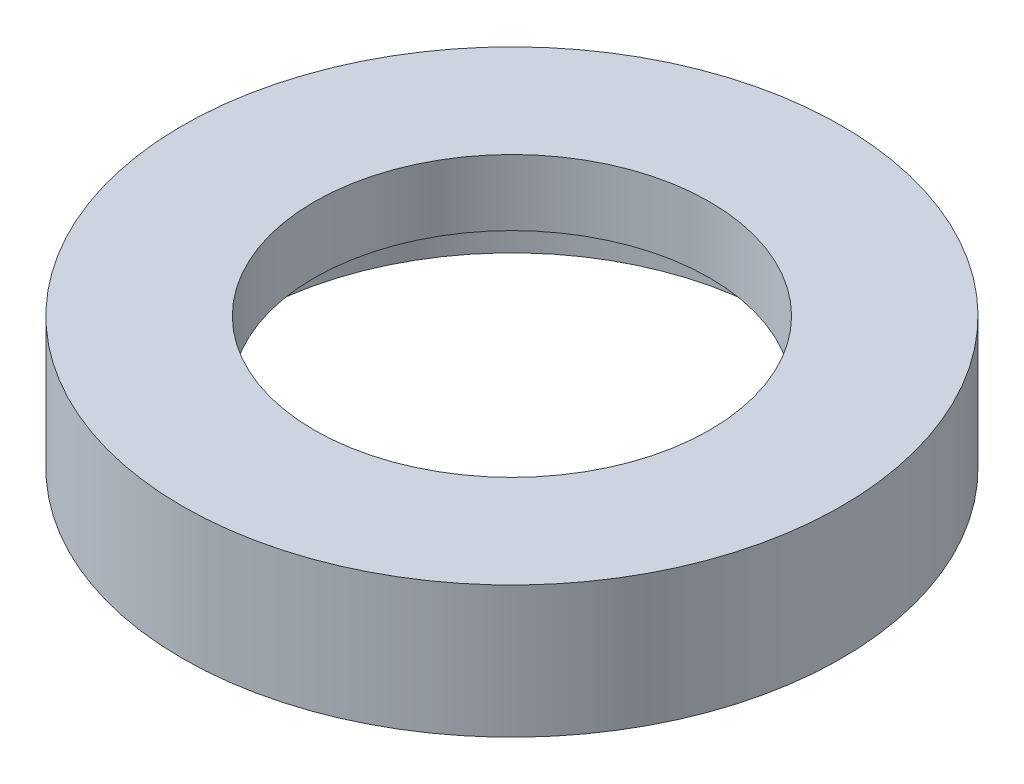
ISO-10303-21;
HEADER;
FILE_DESCRIPTION(('STEP AP214'),'2;1');
FILE_NAME('part.step','',(''),(''),'','','');
FILE_SCHEMA(('AUTOMOTIVE_DESIGN { 1 0 10303 214 1 1 1 1 }'));
ENDSEC;
DATA;
#1=APPLICATION_CONTEXT('core data for automotive mechanical design processes');
#2=APPLICATION_PROTOCOL_DEFINITION('international standard','automotive_design',2000,#1);
#3=PRODUCT_CONTEXT('',#1,'mechanical');
#4=PRODUCT('Part','Part','',(#3));
#5=PRODUCT_RELATED_PRODUCT_CATEGORY('part','',(#4));
#6=PRODUCT_DEFINITION_FORMATION('','',#4);
#7=PRODUCT_DEFINITION_CONTEXT('part definition',#1,'design');
#8=PRODUCT_DEFINITION('design','',#6,#7);
#9=PRODUCT_DEFINITION_SHAPE('','',#8);
#10=(LENGTH_UNIT() NAMED_UNIT(*) SI_UNIT(.MILLI.,.METRE.));
#11=(NAMED_UNIT(*) PLANE_ANGLE_UNIT() SI_UNIT($,.RADIAN.));
#12=(NAMED_UNIT(*) SI_UNIT($,.STERADIAN.) SOLID_ANGLE_UNIT());
#13=UNCERTAINTY_MEASURE_WITH_UNIT(LENGTH_MEASURE(1.E-05),#10,'distance_accuracy_value','');
#14=(GEOMETRIC_REPRESENTATION_CONTEXT(3) GLOBAL_UNCERTAINTY_ASSIGNED_CONTEXT((#13)) GLOBAL_UNIT_ASSIGNED_CONTEXT((#10,
#11,#12)) REPRESENTATION_CONTEXT('',''));
#15=CARTESIAN_POINT('',(0.,0.,0.));
#16=DIRECTION('',(0.,0.,1.));
#17=DIRECTION('',(1.,0.,0.));
#18=AXIS2_PLACEMENT_3D('',#15,#16,#17);
#19=CARTESIAN_POINT('',(0.,0.1,0.));
#20=DIRECTION('',(0.,1.,0.));
#21=DIRECTION('',(0.,0.,1.));
#22=AXIS2_PLACEMENT_3D('',#19,#20,#21);
#23=CYLINDRICAL_SURFACE('',#22,3.);
#24=CARTESIAN_POINT('',(0.,2.,0.));
#25=DIRECTION('',(0.,1.,0.));
#26=DIRECTION('',(0.,0.,1.));
#27=AXIS2_PLACEMENT_3D('',#24,#25,#26);
#28=CIRCLE('',#27,3.);
#29=CARTESIAN_POINT('',(0.,2.,3.));
#30=VERTEX_POINT('',#29);
#31=EDGE_CURVE('E56',#30,#30,#28,.T.);
#32=CARTESIAN_POINT('',(0.,1.,0.));
#33=DIRECTION('',(0.,-1.,0.));
#34=DIRECTION('',(0.,0.,-1.));
#35=AXIS2_PLACEMENT_3D('',#32,#33,#34);
#36=CIRCLE('',#35,3.);
#37=CARTESIAN_POINT('',(0.,1.,3.));
#38=VERTEX_POINT('',#37);
#39=EDGE_CURVE('E47',#38,#38,#36,.F.);
#40=CARTESIAN_POINT('',(0.,2.,3.));
#41=CARTESIAN_POINT('',(0.,1.98958333333333,3.));
#42=CARTESIAN_POINT('',(0.,1.97916666666667,3.));
#43=CARTESIAN_POINT('',(0.,1.95833333333333,3.));
#44=CARTESIAN_POINT('',(0.,1.94791666666667,3.));
#45=CARTESIAN_POINT('',(0.,1.92708333333333,3.));
#46=CARTESIAN_POINT('',(0.,1.91666666666667,3.));
#47=CARTESIAN_POINT('',(0.,1.89583333333333,3.));
#48=CARTESIAN_POINT('',(0.,1.88541666666667,3.));
#49=CARTESIAN_POINT('',(0.,1.86458333333333,3.));
#50=CARTESIAN_POINT('',(0.,1.85416666666667,3.));
#51=CARTESIAN_POINT('',(0.,1.83333333333333,3.));
#52=CARTESIAN_POINT('',(0.,1.82291666666667,3.));
#53=CARTESIAN_POINT('',(0.,1.80208333333333,3.));
#54=CARTESIAN_POINT('',(0.,1.79166666666667,3.));
#55=CARTESIAN_POINT('',(0.,1.77083333333333,3.));
#56=CARTESIAN_POINT('',(0.,1.76041666666667,3.));
#57=CARTESIAN_POINT('',(0.,1.73958333333333,3.));
#58=CARTESIAN_POINT('',(0.,1.72916666666667,3.));
#59=CARTESIAN_POINT('',(0.,1.70833333333333,3.));
#60=CARTESIAN_POINT('',(0.,1.69791666666667,3.));
#61=CARTESIAN_POINT('',(0.,1.67708333333333,3.));
#62=CARTESIAN_POINT('',(0.,1.66666666666667,3.));
#63=CARTESIAN_POINT('',(0.,1.64583333333333,3.));
#64=CARTESIAN_POINT('',(0.,1.63541666666667,3.));
#65=CARTESIAN_POINT('',(0.,1.61458333333333,3.));
#66=CARTESIAN_POINT('',(0.,1.60416666666667,3.));
#67=CARTESIAN_POINT('',(0.,1.58333333333333,3.));
#68=CARTESIAN_POINT('',(0.,1.57291666666667,3.));
#69=CARTESIAN_POINT('',(0.,1.55208333333333,3.));
#70=CARTESIAN_POINT('',(0.,1.54166666666667,3.));
#71=CARTESIAN_POINT('',(0.,1.52083333333333,3.));
#72=CARTESIAN_POINT('',(0.,1.51041666666667,3.));
#73=CARTESIAN_POINT('',(0.,1.48958333333333,3.));
#74=CARTESIAN_POINT('',(0.,1.47916666666667,3.));
#75=CARTESIAN_POINT('',(0.,1.45833333333333,3.));
#76=CARTESIAN_POINT('',(0.,1.44791666666667,3.));
#77=CARTESIAN_POINT('',(0.,1.42708333333333,3.));
#78=CARTESIAN_POINT('',(0.,1.41666666666667,3.));
#79=CARTESIAN_POINT('',(0.,1.39583333333333,3.));
#80=CARTESIAN_POINT('',(0.,1.38541666666667,3.));
#81=CARTESIAN_POINT('',(0.,1.36458333333333,3.));
#82=CARTESIAN_POINT('',(0.,1.35416666666667,3.));
#83=CARTESIAN_POINT('',(0.,1.33333333333333,3.));
#84=CARTESIAN_POINT('',(0.,1.32291666666667,3.));
#85=CARTESIAN_POINT('',(0.,1.30208333333333,3.));
#86=CARTESIAN_POINT('',(0.,1.29166666666667,3.));
#87=CARTESIAN_POINT('',(0.,1.27083333333333,3.));
#88=CARTESIAN_POINT('',(0.,1.26041666666667,3.));
#89=CARTESIAN_POINT('',(0.,1.23958333333333,3.));
#90=CARTESIAN_POINT('',(0.,1.22916666666667,3.));
#91=CARTESIAN_POINT('',(0.,1.20833333333333,3.));
#92=CARTESIAN_POINT('',(0.,1.19791666666667,3.));
#93=CARTESIAN_POINT('',(0.,1.17708333333333,3.));
#94=CARTESIAN_POINT('',(0.,1.16666666666667,3.));
#95=CARTESIAN_POINT('',(0.,1.14583333333333,3.));
#96=CARTESIAN_POINT('',(0.,1.13541666666667,3.));
#97=CARTESIAN_POINT('',(0.,1.11458333333333,3.));
#98=CARTESIAN_POINT('',(0.,1.10416666666667,3.));
#99=CARTESIAN_POINT('',(0.,1.08333333333333,3.));
#100=CARTESIAN_POINT('',(0.,1.07291666666667,3.));
#101=CARTESIAN_POINT('',(0.,1.05208333333333,3.));
#102=CARTESIAN_POINT('',(0.,1.04166666666667,3.));
#103=CARTESIAN_POINT('',(0.,1.02083333333333,3.));
#104=CARTESIAN_POINT('',(0.,1.01041666666667,3.));
#105=CARTESIAN_POINT('',(0.,1.,3.));
#106=B_SPLINE_CURVE_WITH_KNOTS('',3,(#40,#41,#42,#43,#44,#45,#46,#47,#48,#49,#50,#51,#52,#53,
#54,#55,#56,#57,#58,#59,#60,#61,#62,#63,#64,#65,#66,#67,#68,#69,#70,#71,#72,#73,#74,#75,#76,#77,
#78,#79,#80,#81,#82,#83,#84,#85,#86,#87,#88,#89,#90,#91,#92,#93,#94,#95,#96,#97,#98,#99,#100,
#101,#102,#103,#104,#105),.UNSPECIFIED.,.F.,.F.,(4,2,2,2,2,2,2,2,2,2,2,2,2,2,2,2,2,2,2,2,2,2,2,
2,2,2,2,2,2,2,2,2,4),(0.,0.03125,0.0625000000000001,0.0937499999999999,0.125,0.15625,0.1875,
0.21875,0.25,0.28125,0.3125,0.34375,0.375,0.40625,0.4375,0.46875,0.5,0.53125,0.5625,0.59375,
0.625,0.65625,0.6875,0.71875,0.75,0.78125,0.8125,0.84375,0.875,0.90625,0.9375,0.96875,1.),.UNSPECIFIED.);
#107=EDGE_CURVE('BSEAM43',#30,#38,#106,.T.);
#108=ORIENTED_EDGE('',*,*,#31,.T.);
#109=ORIENTED_EDGE('',*,*,#39,.F.);
#110=ORIENTED_EDGE('',*,*,#107,.T.);
#111=ORIENTED_EDGE('',*,*,#107,.F.);
#112=EDGE_LOOP('',(#108,#110,#109,#111));
#113=FACE_BOUND('',#112,.T.);
#114=ADVANCED_FACE('F43',(#113),#23,.F.);
#115=CARTESIAN_POINT('',(0.,2.,0.));
#116=DIRECTION('',(0.,1.,0.));
#117=DIRECTION('',(0.,0.,1.));
#118=AXIS2_PLACEMENT_3D('',#115,#116,#117);
#119=PLANE('',#118);
#120=CARTESIAN_POINT('',(0.,2.,0.));
#121=DIRECTION('',(0.,1.,0.));
#122=DIRECTION('',(0.,0.,1.));
#123=AXIS2_PLACEMENT_3D('',#120,#121,#122);
#124=CIRCLE('',#123,5.);
#125=CARTESIAN_POINT('',(0.,2.,5.));
#126=VERTEX_POINT('',#125);
#127=EDGE_CURVE('E10',#126,#126,#124,.T.);
#128=ORIENTED_EDGE('',*,*,#127,.T.);
#129=EDGE_LOOP('',(#128));
#130=FACE_BOUND('',#129,.T.);
#131=ORIENTED_EDGE('',*,*,#31,.F.);
#132=EDGE_LOOP('',(#131));
#133=FACE_BOUND('',#132,.T.);
#134=ADVANCED_FACE('F73',(#130,#133),#119,.T.);
#135=CARTESIAN_POINT('',(0.,0.,0.));
#136=DIRECTION('',(0.,1.,0.));
#137=DIRECTION('',(0.,0.,1.));
#138=AXIS2_PLACEMENT_3D('',#135,#136,#137);
#139=PLANE('',#138);
#140=CARTESIAN_POINT('',(0.,0.,0.));
#141=DIRECTION('',(0.,-1.,0.));
#142=DIRECTION('',(0.,0.,-1.));
#143=AXIS2_PLACEMENT_3D('',#140,#141,#142);
#144=CIRCLE('',#143,4.);
#145=CARTESIAN_POINT('',(0.,0.,-4.));
#146=VERTEX_POINT('',#145);
#147=EDGE_CURVE('E60',#146,#146,#144,.T.);
#148=ORIENTED_EDGE('',*,*,#147,.F.);
#149=EDGE_LOOP('',(#148));
#150=FACE_BOUND('',#149,.T.);
#151=CARTESIAN_POINT('',(0.,0.,0.));
#152=DIRECTION('',(0.,1.,0.));
#153=DIRECTION('',(0.,0.,1.));
#154=AXIS2_PLACEMENT_3D('',#151,#152,#153);
#155=CIRCLE('',#154,5.);
#156=CARTESIAN_POINT('',(0.,0.,5.));
#157=VERTEX_POINT('',#156);
#158=EDGE_CURVE('E51',#157,#157,#155,.T.);
#159=ORIENTED_EDGE('',*,*,#158,.F.);
#160=EDGE_LOOP('',(#159));
#161=FACE_BOUND('',#160,.T.);
#162=ADVANCED_FACE('F80',(#150,#161),#139,.F.);
#163=CARTESIAN_POINT('',(0.,2.,0.));
#164=DIRECTION('',(0.,-1.,0.));
#165=DIRECTION('',(0.,0.,-1.));
#166=AXIS2_PLACEMENT_3D('',#163,#164,#165);
#167=CYLINDRICAL_SURFACE('',#166,5.);
#168=ORIENTED_EDGE('',*,*,#127,.F.);
#169=EDGE_LOOP('',(#168));
#170=FACE_BOUND('',#169,.T.);
#171=ORIENTED_EDGE('',*,*,#158,.T.);
#172=EDGE_LOOP('',(#171));
#173=FACE_BOUND('',#172,.T.);
#174=ADVANCED_FACE('F45',(#170,#173),#167,.T.);
#175=CARTESIAN_POINT('',(0.,1.,0.));
#176=DIRECTION('',(0.,-1.,0.));
#177=DIRECTION('',(0.,0.,-1.));
#178=AXIS2_PLACEMENT_3D('',#175,#176,#177);
#179=PLANE('',#178);
#180=CARTESIAN_POINT('',(0.,1.,0.));
#181=DIRECTION('',(0.,-1.,0.));
#182=DIRECTION('',(0.,0.,-1.));
#183=AXIS2_PLACEMENT_3D('',#180,#181,#182);
#184=CIRCLE('',#183,4.);
#185=CARTESIAN_POINT('',(0.,1.,-4.));
#186=VERTEX_POINT('',#185);
#187=EDGE_CURVE('E63',#186,#186,#184,.T.);
#188=ORIENTED_EDGE('',*,*,#187,.T.);
#189=EDGE_LOOP('',(#188));
#190=FACE_BOUND('',#189,.T.);
#191=ORIENTED_EDGE('',*,*,#39,.T.);
#192=EDGE_LOOP('',(#191));
#193=FACE_BOUND('',#192,.T.);
#194=ADVANCED_FACE('F70',(#190,#193),#179,.T.);
#195=CARTESIAN_POINT('',(0.,1.,0.));
#196=DIRECTION('',(0.,-1.,0.));
#197=DIRECTION('',(0.,0.,-1.));
#198=AXIS2_PLACEMENT_3D('',#195,#196,#197);
#199=CYLINDRICAL_SURFACE('',#198,4.);
#200=ORIENTED_EDGE('',*,*,#187,.F.);
#201=EDGE_LOOP('',(#200));
#202=FACE_BOUND('',#201,.T.);
#203=ORIENTED_EDGE('',*,*,#147,.T.);
#204=EDGE_LOOP('',(#203));
#205=FACE_BOUND('',#204,.T.);
#206=ADVANCED_FACE('F83',(#202,#205),#199,.F.);
#207=CLOSED_SHELL('',(#114,#134,#162,#174,#194,#206));
#208=MANIFOLD_SOLID_BREP('B2',#207);
#209=ADVANCED_BREP_SHAPE_REPRESENTATION('',(#18,#208),#14);
#210=SHAPE_DEFINITION_REPRESENTATION(#9,#209);
ENDSEC;
END-ISO-10303-21;
